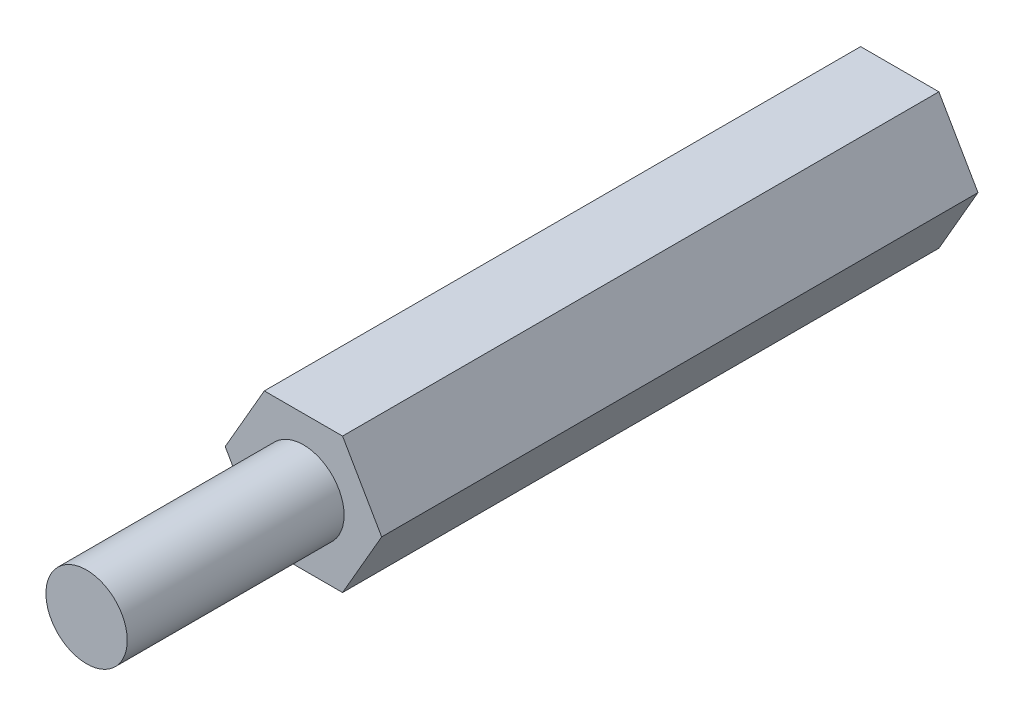
ISO-10303-21;
HEADER;
FILE_DESCRIPTION(('STEP AP214'),'2;1');
FILE_NAME('part.step','',(''),(''),'','','');
FILE_SCHEMA(('AUTOMOTIVE_DESIGN { 1 0 10303 214 1 1 1 1 }'));
ENDSEC;
DATA;
#1=APPLICATION_CONTEXT('core data for automotive mechanical design processes');
#2=APPLICATION_PROTOCOL_DEFINITION('international standard','automotive_design',2000,#1);
#3=PRODUCT_CONTEXT('',#1,'mechanical');
#4=PRODUCT('Part','Part','',(#3));
#5=PRODUCT_RELATED_PRODUCT_CATEGORY('part','',(#4));
#6=PRODUCT_DEFINITION_FORMATION('','',#4);
#7=PRODUCT_DEFINITION_CONTEXT('part definition',#1,'design');
#8=PRODUCT_DEFINITION('design','',#6,#7);
#9=PRODUCT_DEFINITION_SHAPE('','',#8);
#10=(LENGTH_UNIT() NAMED_UNIT(*) SI_UNIT(.MILLI.,.METRE.));
#11=(NAMED_UNIT(*) PLANE_ANGLE_UNIT() SI_UNIT($,.RADIAN.));
#12=(NAMED_UNIT(*) SI_UNIT($,.STERADIAN.) SOLID_ANGLE_UNIT());
#13=UNCERTAINTY_MEASURE_WITH_UNIT(LENGTH_MEASURE(1.E-05),#10,'distance_accuracy_value','');
#14=(GEOMETRIC_REPRESENTATION_CONTEXT(3) GLOBAL_UNCERTAINTY_ASSIGNED_CONTEXT((#13)) GLOBAL_UNIT_ASSIGNED_CONTEXT((#10,
#11,#12)) REPRESENTATION_CONTEXT('',''));
#15=CARTESIAN_POINT('',(0.,0.,0.));
#16=DIRECTION('',(0.,0.,1.));
#17=DIRECTION('',(1.,0.,0.));
#18=AXIS2_PLACEMENT_3D('',#15,#16,#17);
#19=CARTESIAN_POINT('',(1.44337567297407,-2.50000000000001,22.));
#20=DIRECTION('',(0.,0.,1.));
#21=DIRECTION('',(1.,0.,0.));
#22=AXIS2_PLACEMENT_3D('',#19,#20,#21);
#23=PLANE('',#22);
#24=DIRECTION('',(1.,0.,0.));
#25=VECTOR('',#24,1.);
#26=CARTESIAN_POINT('',(-1.44337567297407,-2.5,22.));
#27=LINE('',#26,#25);
#28=CARTESIAN_POINT('',(-1.44337567297407,-2.5,22.));
#29=VERTEX_POINT('',#28);
#30=CARTESIAN_POINT('',(1.44337567297406,-2.50000000000001,22.));
#31=VERTEX_POINT('',#30);
#32=EDGE_CURVE('E115',#29,#31,#27,.T.);
#33=ORIENTED_EDGE('',*,*,#32,.T.);
#34=DIRECTION('',(0.499999999999999,0.866025403784439,0.));
#35=VECTOR('',#34,1.);
#36=CARTESIAN_POINT('',(1.44337567297406,-2.50000000000001,22.));
#37=LINE('',#36,#35);
#38=CARTESIAN_POINT('',(2.88675134594814,0.,22.));
#39=VERTEX_POINT('',#38);
#40=EDGE_CURVE('E117',#31,#39,#37,.T.);
#41=ORIENTED_EDGE('',*,*,#40,.T.);
#42=DIRECTION('',(-0.5,0.866025403784439,0.));
#43=VECTOR('',#42,1.);
#44=CARTESIAN_POINT('',(2.88675134594814,0.,22.));
#45=LINE('',#44,#43);
#46=CARTESIAN_POINT('',(1.44337567297407,2.50000000000002,22.));
#47=VERTEX_POINT('',#46);
#48=EDGE_CURVE('E119',#39,#47,#45,.T.);
#49=ORIENTED_EDGE('',*,*,#48,.T.);
#50=DIRECTION('',(-1.,0.,0.));
#51=VECTOR('',#50,1.);
#52=CARTESIAN_POINT('',(1.44337567297407,2.50000000000002,22.));
#53=LINE('',#52,#51);
#54=CARTESIAN_POINT('',(-1.44337567297407,2.50000000000002,22.));
#55=VERTEX_POINT('',#54);
#56=EDGE_CURVE('E121',#47,#55,#53,.T.);
#57=ORIENTED_EDGE('',*,*,#56,.T.);
#58=DIRECTION('',(-0.500000000000001,-0.866025403784438,0.));
#59=VECTOR('',#58,1.);
#60=CARTESIAN_POINT('',(-1.44337567297407,2.50000000000002,22.));
#61=LINE('',#60,#59);
#62=CARTESIAN_POINT('',(-2.88675134594814,0.,22.));
#63=VERTEX_POINT('',#62);
#64=EDGE_CURVE('E48',#55,#63,#61,.T.);
#65=ORIENTED_EDGE('',*,*,#64,.T.);
#66=DIRECTION('',(0.5,-0.866025403784439,0.));
#67=VECTOR('',#66,1.);
#68=CARTESIAN_POINT('',(-2.88675134594814,0.,22.));
#69=LINE('',#68,#67);
#70=EDGE_CURVE('E43',#63,#29,#69,.T.);
#71=ORIENTED_EDGE('',*,*,#70,.T.);
#72=EDGE_LOOP('',(#33,#41,#49,#57,#65,#71));
#73=FACE_BOUND('',#72,.T.);
#74=CARTESIAN_POINT('',(0.,0.,22.));
#75=DIRECTION('',(0.,0.,1.));
#76=DIRECTION('',(1.,0.,0.));
#77=AXIS2_PLACEMENT_3D('',#74,#75,#76);
#78=CIRCLE('',#77,1.5);
#79=CARTESIAN_POINT('',(1.5,0.,22.));
#80=VERTEX_POINT('',#79);
#81=EDGE_CURVE('E94',#80,#80,#78,.T.);
#82=ORIENTED_EDGE('',*,*,#81,.F.);
#83=EDGE_LOOP('',(#82));
#84=FACE_BOUND('',#83,.T.);
#85=ADVANCED_FACE('F28',(#73,#84),#23,.T.);
#86=CARTESIAN_POINT('',(-1.44337567297407,-2.5,22.));
#87=DIRECTION('',(0.,1.,0.));
#88=DIRECTION('',(-1.,0.,0.));
#89=AXIS2_PLACEMENT_3D('',#86,#87,#88);
#90=PLANE('',#89);
#91=DIRECTION('',(1.,0.,0.));
#92=VECTOR('',#91,1.);
#93=CARTESIAN_POINT('',(-1.44337567297407,-2.5,0.));
#94=LINE('',#93,#92);
#95=CARTESIAN_POINT('',(-1.44337567297407,-2.5,0.));
#96=VERTEX_POINT('',#95);
#97=CARTESIAN_POINT('',(1.44337567297406,-2.50000000000001,0.));
#98=VERTEX_POINT('',#97);
#99=EDGE_CURVE('E102',#96,#98,#94,.T.);
#100=ORIENTED_EDGE('',*,*,#99,.T.);
#101=DIRECTION('',(0.,0.,-1.));
#102=VECTOR('',#101,1.);
#103=CARTESIAN_POINT('',(1.44337567297406,-2.50000000000001,22.));
#104=LINE('',#103,#102);
#105=EDGE_CURVE('E11',#31,#98,#104,.T.);
#106=ORIENTED_EDGE('',*,*,#105,.F.);
#107=ORIENTED_EDGE('',*,*,#32,.F.);
#108=DIRECTION('',(0.,0.,-1.));
#109=VECTOR('',#108,1.);
#110=CARTESIAN_POINT('',(-1.44337567297407,-2.5,22.));
#111=LINE('',#110,#109);
#112=EDGE_CURVE('E125',#29,#96,#111,.T.);
#113=ORIENTED_EDGE('',*,*,#112,.T.);
#114=EDGE_LOOP('',(#100,#106,#107,#113));
#115=FACE_BOUND('',#114,.T.);
#116=ADVANCED_FACE('F30',(#115),#90,.F.);
#117=CARTESIAN_POINT('',(1.44337567297406,-2.50000000000001,22.));
#118=DIRECTION('',(-0.866025403784439,0.499999999999999,0.));
#119=DIRECTION('',(-0.499999999999999,-0.866025403784439,0.));
#120=AXIS2_PLACEMENT_3D('',#117,#118,#119);
#121=PLANE('',#120);
#122=DIRECTION('',(0.499999999999999,0.866025403784439,0.));
#123=VECTOR('',#122,1.);
#124=CARTESIAN_POINT('',(1.44337567297406,-2.50000000000001,0.));
#125=LINE('',#124,#123);
#126=CARTESIAN_POINT('',(2.88675134594814,0.,0.));
#127=VERTEX_POINT('',#126);
#128=EDGE_CURVE('E105',#98,#127,#125,.T.);
#129=ORIENTED_EDGE('',*,*,#128,.T.);
#130=DIRECTION('',(0.,0.,-1.));
#131=VECTOR('',#130,1.);
#132=CARTESIAN_POINT('',(2.88675134594814,0.,22.));
#133=LINE('',#132,#131);
#134=EDGE_CURVE('E36',#39,#127,#133,.T.);
#135=ORIENTED_EDGE('',*,*,#134,.F.);
#136=ORIENTED_EDGE('',*,*,#40,.F.);
#137=ORIENTED_EDGE('',*,*,#105,.T.);
#138=EDGE_LOOP('',(#129,#135,#136,#137));
#139=FACE_BOUND('',#138,.T.);
#140=ADVANCED_FACE('F162',(#139),#121,.F.);
#141=CARTESIAN_POINT('',(2.88675134594814,0.,22.));
#142=DIRECTION('',(-0.866025403784439,-0.5,0.));
#143=DIRECTION('',(0.5,-0.866025403784439,0.));
#144=AXIS2_PLACEMENT_3D('',#141,#142,#143);
#145=PLANE('',#144);
#146=DIRECTION('',(-0.5,0.866025403784439,0.));
#147=VECTOR('',#146,1.);
#148=CARTESIAN_POINT('',(2.88675134594814,0.,0.));
#149=LINE('',#148,#147);
#150=CARTESIAN_POINT('',(1.44337567297407,2.50000000000002,0.));
#151=VERTEX_POINT('',#150);
#152=EDGE_CURVE('E107',#127,#151,#149,.T.);
#153=ORIENTED_EDGE('',*,*,#152,.T.);
#154=DIRECTION('',(0.,0.,-1.));
#155=VECTOR('',#154,1.);
#156=CARTESIAN_POINT('',(1.44337567297407,2.50000000000002,22.));
#157=LINE('',#156,#155);
#158=EDGE_CURVE('E134',#47,#151,#157,.T.);
#159=ORIENTED_EDGE('',*,*,#158,.F.);
#160=ORIENTED_EDGE('',*,*,#48,.F.);
#161=ORIENTED_EDGE('',*,*,#134,.T.);
#162=EDGE_LOOP('',(#153,#159,#160,#161));
#163=FACE_BOUND('',#162,.T.);
#164=ADVANCED_FACE('F141',(#163),#145,.F.);
#165=CARTESIAN_POINT('',(1.44337567297407,2.50000000000002,22.));
#166=DIRECTION('',(0.,-1.,0.));
#167=DIRECTION('',(1.,0.,0.));
#168=AXIS2_PLACEMENT_3D('',#165,#166,#167);
#169=PLANE('',#168);
#170=DIRECTION('',(-1.,0.,0.));
#171=VECTOR('',#170,1.);
#172=CARTESIAN_POINT('',(1.44337567297407,2.50000000000002,0.));
#173=LINE('',#172,#171);
#174=CARTESIAN_POINT('',(-1.44337567297407,2.50000000000002,0.));
#175=VERTEX_POINT('',#174);
#176=EDGE_CURVE('E109',#151,#175,#173,.T.);
#177=ORIENTED_EDGE('',*,*,#176,.T.);
#178=DIRECTION('',(0.,0.,-1.));
#179=VECTOR('',#178,1.);
#180=CARTESIAN_POINT('',(-1.44337567297407,2.50000000000002,22.));
#181=LINE('',#180,#179);
#182=EDGE_CURVE('E131',#55,#175,#181,.T.);
#183=ORIENTED_EDGE('',*,*,#182,.F.);
#184=ORIENTED_EDGE('',*,*,#56,.F.);
#185=ORIENTED_EDGE('',*,*,#158,.T.);
#186=EDGE_LOOP('',(#177,#183,#184,#185));
#187=FACE_BOUND('',#186,.T.);
#188=ADVANCED_FACE('F152',(#187),#169,.F.);
#189=CARTESIAN_POINT('',(-1.44337567297407,2.50000000000002,22.));
#190=DIRECTION('',(0.866025403784438,-0.500000000000001,0.));
#191=DIRECTION('',(0.500000000000001,0.866025403784438,0.));
#192=AXIS2_PLACEMENT_3D('',#189,#190,#191);
#193=PLANE('',#192);
#194=DIRECTION('',(-0.500000000000001,-0.866025403784438,0.));
#195=VECTOR('',#194,1.);
#196=CARTESIAN_POINT('',(-1.44337567297407,2.50000000000002,0.));
#197=LINE('',#196,#195);
#198=CARTESIAN_POINT('',(-2.88675134594814,0.,0.));
#199=VERTEX_POINT('',#198);
#200=EDGE_CURVE('E111',#175,#199,#197,.T.);
#201=ORIENTED_EDGE('',*,*,#200,.T.);
#202=DIRECTION('',(0.,0.,-1.));
#203=VECTOR('',#202,1.);
#204=CARTESIAN_POINT('',(-2.88675134594814,0.,22.));
#205=LINE('',#204,#203);
#206=EDGE_CURVE('E128',#63,#199,#205,.T.);
#207=ORIENTED_EDGE('',*,*,#206,.F.);
#208=ORIENTED_EDGE('',*,*,#64,.F.);
#209=ORIENTED_EDGE('',*,*,#182,.T.);
#210=EDGE_LOOP('',(#201,#207,#208,#209));
#211=FACE_BOUND('',#210,.T.);
#212=ADVANCED_FACE('F155',(#211),#193,.F.);
#213=CARTESIAN_POINT('',(-2.88675134594814,0.,22.));
#214=DIRECTION('',(0.866025403784439,0.5,0.));
#215=DIRECTION('',(-0.5,0.866025403784439,0.));
#216=AXIS2_PLACEMENT_3D('',#213,#214,#215);
#217=PLANE('',#216);
#218=DIRECTION('',(0.5,-0.866025403784439,0.));
#219=VECTOR('',#218,1.);
#220=CARTESIAN_POINT('',(-2.88675134594814,0.,0.));
#221=LINE('',#220,#219);
#222=EDGE_CURVE('E113',#199,#96,#221,.T.);
#223=ORIENTED_EDGE('',*,*,#222,.T.);
#224=ORIENTED_EDGE('',*,*,#112,.F.);
#225=ORIENTED_EDGE('',*,*,#70,.F.);
#226=ORIENTED_EDGE('',*,*,#206,.T.);
#227=EDGE_LOOP('',(#223,#224,#225,#226));
#228=FACE_BOUND('',#227,.T.);
#229=ADVANCED_FACE('F157',(#228),#217,.F.);
#230=CARTESIAN_POINT('',(1.44337567297407,-2.50000000000001,0.));
#231=DIRECTION('',(0.,0.,1.));
#232=DIRECTION('',(1.,0.,0.));
#233=AXIS2_PLACEMENT_3D('',#230,#231,#232);
#234=PLANE('',#233);
#235=CARTESIAN_POINT('',(0.,0.,0.));
#236=DIRECTION('',(0.,0.,-1.));
#237=DIRECTION('',(-1.,0.,0.));
#238=AXIS2_PLACEMENT_3D('',#235,#236,#237);
#239=CIRCLE('',#238,1.24999999999999);
#240=CARTESIAN_POINT('',(-1.24999999999999,0.,0.));
#241=VERTEX_POINT('',#240);
#242=EDGE_CURVE('E91',#241,#241,#239,.T.);
#243=ORIENTED_EDGE('',*,*,#242,.F.);
#244=EDGE_LOOP('',(#243));
#245=FACE_BOUND('',#244,.T.);
#246=ORIENTED_EDGE('',*,*,#99,.F.);
#247=ORIENTED_EDGE('',*,*,#222,.F.);
#248=ORIENTED_EDGE('',*,*,#200,.F.);
#249=ORIENTED_EDGE('',*,*,#176,.F.);
#250=ORIENTED_EDGE('',*,*,#152,.F.);
#251=ORIENTED_EDGE('',*,*,#128,.F.);
#252=EDGE_LOOP('',(#246,#247,#248,#249,#250,#251));
#253=FACE_BOUND('',#252,.T.);
#254=ADVANCED_FACE('F147',(#245,#253),#234,.F.);
#255=CARTESIAN_POINT('',(0.,0.,30.));
#256=DIRECTION('',(0.,0.,-1.));
#257=DIRECTION('',(-1.,0.,0.));
#258=AXIS2_PLACEMENT_3D('',#255,#256,#257);
#259=CYLINDRICAL_SURFACE('',#258,1.5);
#260=CARTESIAN_POINT('',(0.,0.,30.));
#261=DIRECTION('',(0.,0.,1.));
#262=DIRECTION('',(1.,0.,0.));
#263=AXIS2_PLACEMENT_3D('',#260,#261,#262);
#264=CIRCLE('',#263,1.5);
#265=CARTESIAN_POINT('',(1.5,0.,30.));
#266=VERTEX_POINT('',#265);
#267=EDGE_CURVE('E99',#266,#266,#264,.T.);
#268=ORIENTED_EDGE('',*,*,#267,.F.);
#269=EDGE_LOOP('',(#268));
#270=FACE_BOUND('',#269,.T.);
#271=ORIENTED_EDGE('',*,*,#81,.T.);
#272=EDGE_LOOP('',(#271));
#273=FACE_BOUND('',#272,.T.);
#274=ADVANCED_FACE('F200',(#270,#273),#259,.T.);
#275=CARTESIAN_POINT('',(0.,0.,30.));
#276=DIRECTION('',(0.,0.,1.));
#277=DIRECTION('',(1.,0.,0.));
#278=AXIS2_PLACEMENT_3D('',#275,#276,#277);
#279=PLANE('',#278);
#280=ORIENTED_EDGE('',*,*,#267,.T.);
#281=EDGE_LOOP('',(#280));
#282=FACE_BOUND('',#281,.T.);
#283=ADVANCED_FACE('F211',(#282),#279,.T.);
#284=CARTESIAN_POINT('',(0.,0.,0.));
#285=DIRECTION('',(0.,0.,-1.));
#286=DIRECTION('',(-1.,0.,0.));
#287=AXIS2_PLACEMENT_3D('',#284,#285,#286);
#288=CYLINDRICAL_SURFACE('',#287,1.24999999999999);
#289=CARTESIAN_POINT('',(0.,0.,11.));
#290=DIRECTION('',(0.,0.,-1.));
#291=DIRECTION('',(-1.,0.,0.));
#292=AXIS2_PLACEMENT_3D('',#289,#290,#291);
#293=CIRCLE('',#292,1.25);
#294=CARTESIAN_POINT('',(-1.25,0.,11.));
#295=VERTEX_POINT('',#294);
#296=EDGE_CURVE('E89',#295,#295,#293,.T.);
#297=ORIENTED_EDGE('',*,*,#296,.F.);
#298=EDGE_LOOP('',(#297));
#299=FACE_BOUND('',#298,.T.);
#300=ORIENTED_EDGE('',*,*,#242,.T.);
#301=EDGE_LOOP('',(#300));
#302=FACE_BOUND('',#301,.T.);
#303=ADVANCED_FACE('F85',(#299,#302),#288,.F.);
#304=CARTESIAN_POINT('',(0.,0.,11.));
#305=DIRECTION('',(0.,0.,-1.));
#306=DIRECTION('',(-1.,0.,0.));
#307=AXIS2_PLACEMENT_3D('',#304,#305,#306);
#308=CONICAL_SURFACE('',#307,1.25,1.02974425867665);
#309=CARTESIAN_POINT('',(0.,0.,11.7510757737845));
#310=VERTEX_POINT('',#309);
#311=VERTEX_LOOP('',#310);
#312=FACE_BOUND('',#311,.T.);
#313=ORIENTED_EDGE('',*,*,#296,.T.);
#314=EDGE_LOOP('',(#313));
#315=FACE_BOUND('',#314,.T.);
#316=ADVANCED_FACE('F82',(#312,#315),#308,.F.);
#317=CLOSED_SHELL('',(#85,#116,#140,#164,#188,#212,#229,#254,#274,#283,#303,#316));
#318=MANIFOLD_SOLID_BREP('B2',#317);
#319=ADVANCED_BREP_SHAPE_REPRESENTATION('',(#18,#318),#14);
#320=SHAPE_DEFINITION_REPRESENTATION(#9,#319);
ENDSEC;
END-ISO-10303-21;
